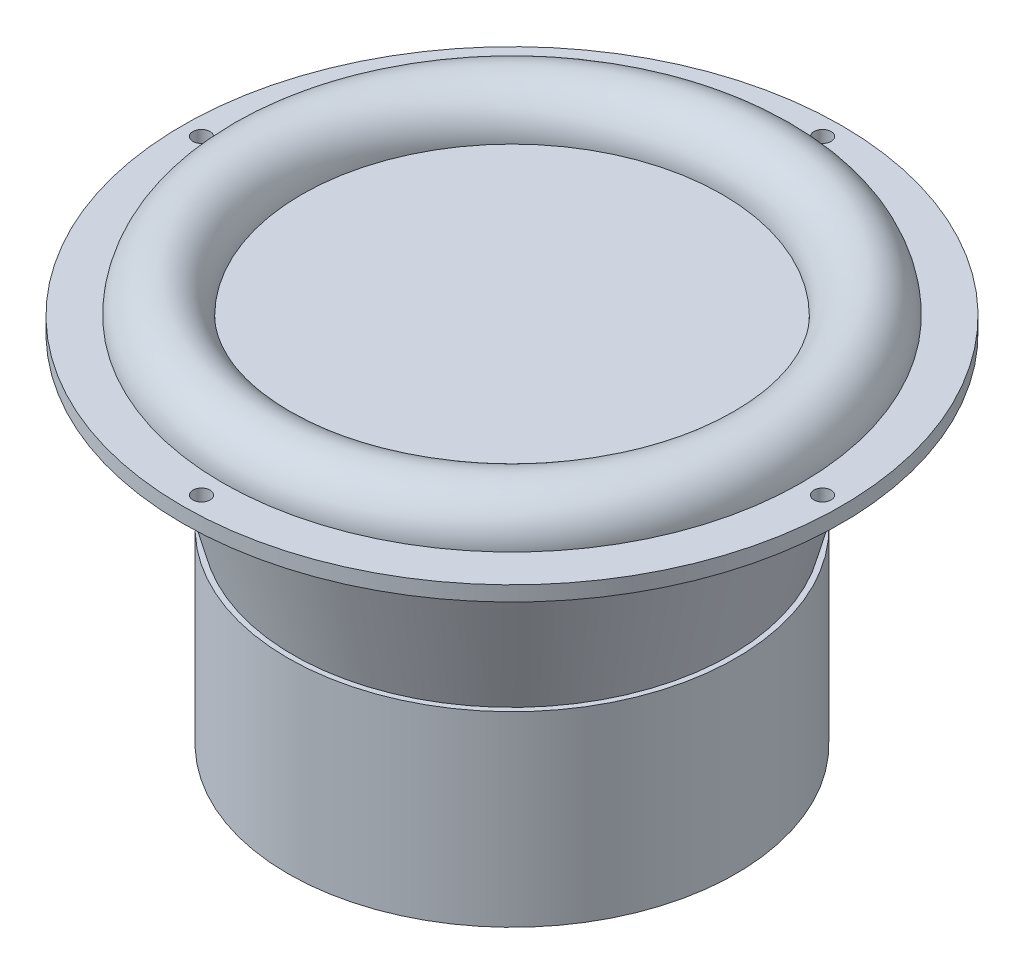
ISO-10303-21;
HEADER;
FILE_DESCRIPTION(('STEP AP214'),'2;1');
FILE_NAME('part.step','',(''),(''),'','','');
FILE_SCHEMA(('AUTOMOTIVE_DESIGN { 1 0 10303 214 1 1 1 1 }'));
ENDSEC;
DATA;
#1=APPLICATION_CONTEXT('core data for automotive mechanical design processes');
#2=APPLICATION_PROTOCOL_DEFINITION('international standard','automotive_design',2000,#1);
#3=PRODUCT_CONTEXT('',#1,'mechanical');
#4=PRODUCT('Part','Part','',(#3));
#5=PRODUCT_RELATED_PRODUCT_CATEGORY('part','',(#4));
#6=PRODUCT_DEFINITION_FORMATION('','',#4);
#7=PRODUCT_DEFINITION_CONTEXT('part definition',#1,'design');
#8=PRODUCT_DEFINITION('design','',#6,#7);
#9=PRODUCT_DEFINITION_SHAPE('','',#8);
#10=(LENGTH_UNIT() NAMED_UNIT(*) SI_UNIT(.MILLI.,.METRE.));
#11=(NAMED_UNIT(*) PLANE_ANGLE_UNIT() SI_UNIT($,.RADIAN.));
#12=(NAMED_UNIT(*) SI_UNIT($,.STERADIAN.) SOLID_ANGLE_UNIT());
#13=UNCERTAINTY_MEASURE_WITH_UNIT(LENGTH_MEASURE(1.E-05),#10,'distance_accuracy_value','');
#14=(GEOMETRIC_REPRESENTATION_CONTEXT(3) GLOBAL_UNCERTAINTY_ASSIGNED_CONTEXT((#13)) GLOBAL_UNIT_ASSIGNED_CONTEXT((#10,
#11,#12)) REPRESENTATION_CONTEXT('',''));
#15=CARTESIAN_POINT('',(0.,0.,0.));
#16=DIRECTION('',(0.,0.,1.));
#17=DIRECTION('',(1.,0.,0.));
#18=AXIS2_PLACEMENT_3D('',#15,#16,#17);
#19=CARTESIAN_POINT('',(60.,0.,0.));
#20=DIRECTION('',(0.,-1.,0.));
#21=DIRECTION('',(0.,0.,-1.));
#22=AXIS2_PLACEMENT_3D('',#19,#20,#21);
#23=PLANE('',#22);
#24=CARTESIAN_POINT('',(0.,0.,0.));
#25=DIRECTION('',(0.,-1.,0.));
#26=DIRECTION('',(0.,0.,-1.));
#27=AXIS2_PLACEMENT_3D('',#24,#25,#26);
#28=CIRCLE('',#27,60.);
#29=CARTESIAN_POINT('',(0.,0.,-60.));
#30=VERTEX_POINT('',#29);
#31=EDGE_CURVE('E10',#30,#30,#28,.T.);
#32=ORIENTED_EDGE('',*,*,#31,.T.);
#33=EDGE_LOOP('',(#32));
#34=FACE_BOUND('',#33,.T.);
#35=ADVANCED_FACE('F31',(#34),#23,.T.);
#36=CARTESIAN_POINT('',(0.,-46.3084579210508,0.));
#37=DIRECTION('',(0.,-1.,0.));
#38=DIRECTION('',(0.,0.,-1.));
#39=AXIS2_PLACEMENT_3D('',#36,#37,#38);
#40=CYLINDRICAL_SURFACE('',#39,60.);
#41=CARTESIAN_POINT('',(0.,50.,0.));
#42=DIRECTION('',(0.,-1.,0.));
#43=DIRECTION('',(0.,0.,-1.));
#44=AXIS2_PLACEMENT_3D('',#41,#42,#43);
#45=CIRCLE('',#44,60.);
#46=CARTESIAN_POINT('',(0.,50.,-60.));
#47=VERTEX_POINT('',#46);
#48=EDGE_CURVE('E38',#47,#47,#45,.T.);
#49=ORIENTED_EDGE('',*,*,#48,.T.);
#50=EDGE_LOOP('',(#49));
#51=FACE_BOUND('',#50,.T.);
#52=ORIENTED_EDGE('',*,*,#31,.F.);
#53=EDGE_LOOP('',(#52));
#54=FACE_BOUND('',#53,.T.);
#55=ADVANCED_FACE('F93',(#51,#54),#40,.T.);
#56=CARTESIAN_POINT('',(58.5851066636273,50.,0.));
#57=DIRECTION('',(0.,1.,0.));
#58=DIRECTION('',(0.,0.,1.));
#59=AXIS2_PLACEMENT_3D('',#56,#57,#58);
#60=PLANE('',#59);
#61=CARTESIAN_POINT('',(0.,50.,0.));
#62=DIRECTION('',(0.,-1.,0.));
#63=DIRECTION('',(0.,0.,-1.));
#64=AXIS2_PLACEMENT_3D('',#61,#62,#63);
#65=CIRCLE('',#64,58.5851066636273);
#66=CARTESIAN_POINT('',(0.,50.,-58.5851066636273));
#67=VERTEX_POINT('',#66);
#68=EDGE_CURVE('E43',#67,#67,#65,.T.);
#69=ORIENTED_EDGE('',*,*,#68,.T.);
#70=EDGE_LOOP('',(#69));
#71=FACE_BOUND('',#70,.T.);
#72=ORIENTED_EDGE('',*,*,#48,.F.);
#73=EDGE_LOOP('',(#72));
#74=FACE_BOUND('',#73,.T.);
#75=ADVANCED_FACE('F78',(#71,#74),#60,.T.);
#76=CARTESIAN_POINT('',(0.,50.,0.));
#77=DIRECTION('',(0.,1.,0.));
#78=DIRECTION('',(0.,0.,1.));
#79=AXIS2_PLACEMENT_3D('',#76,#77,#78);
#80=CONICAL_SURFACE('',#79,58.5851066636273,0.261799387799143);
#81=CARTESIAN_POINT('',(0.,95.4,0.));
#82=DIRECTION('',(0.,-1.,0.));
#83=DIRECTION('',(0.,0.,-1.));
#84=AXIS2_PLACEMENT_3D('',#81,#82,#83);
#85=CIRCLE('',#84,70.75);
#86=CARTESIAN_POINT('',(0.,95.4,-70.75));
#87=VERTEX_POINT('',#86);
#88=EDGE_CURVE('E73',#87,#87,#85,.T.);
#89=ORIENTED_EDGE('',*,*,#88,.T.);
#90=EDGE_LOOP('',(#89));
#91=FACE_BOUND('',#90,.T.);
#92=ORIENTED_EDGE('',*,*,#68,.F.);
#93=EDGE_LOOP('',(#92));
#94=FACE_BOUND('',#93,.T.);
#95=ADVANCED_FACE('F81',(#91,#94),#80,.T.);
#96=CARTESIAN_POINT('',(88.25,95.4,0.));
#97=DIRECTION('',(0.,-1.,0.));
#98=DIRECTION('',(0.,0.,-1.));
#99=AXIS2_PLACEMENT_3D('',#96,#97,#98);
#100=PLANE('',#99);
#101=CARTESIAN_POINT('',(-83.15,95.4,0.));
#102=DIRECTION('',(0.,-1.,0.));
#103=DIRECTION('',(0.,0.,-1.));
#104=AXIS2_PLACEMENT_3D('',#101,#102,#103);
#105=CIRCLE('',#104,2.29999999999998);
#106=CARTESIAN_POINT('',(-83.15,95.4,-2.29999999999998));
#107=VERTEX_POINT('',#106);
#108=EDGE_CURVE('E203',#107,#107,#105,.T.);
#109=ORIENTED_EDGE('',*,*,#108,.F.);
#110=EDGE_LOOP('',(#109));
#111=FACE_BOUND('',#110,.T.);
#112=CARTESIAN_POINT('',(0.,95.4,-83.15));
#113=DIRECTION('',(0.,-1.,0.));
#114=DIRECTION('',(0.,0.,-1.));
#115=AXIS2_PLACEMENT_3D('',#112,#113,#114);
#116=CIRCLE('',#115,2.29999999999998);
#117=CARTESIAN_POINT('',(0.,95.4,-85.45));
#118=VERTEX_POINT('',#117);
#119=EDGE_CURVE('E34',#118,#118,#116,.T.);
#120=ORIENTED_EDGE('',*,*,#119,.F.);
#121=EDGE_LOOP('',(#120));
#122=FACE_BOUND('',#121,.T.);
#123=CARTESIAN_POINT('',(83.15,95.4,0.));
#124=DIRECTION('',(0.,-1.,0.));
#125=DIRECTION('',(0.,0.,-1.));
#126=AXIS2_PLACEMENT_3D('',#123,#124,#125);
#127=CIRCLE('',#126,2.29999999999998);
#128=CARTESIAN_POINT('',(83.15,95.4,-2.29999999999998));
#129=VERTEX_POINT('',#128);
#130=EDGE_CURVE('E56',#129,#129,#127,.T.);
#131=ORIENTED_EDGE('',*,*,#130,.F.);
#132=EDGE_LOOP('',(#131));
#133=FACE_BOUND('',#132,.T.);
#134=CARTESIAN_POINT('',(0.,95.4,83.15));
#135=DIRECTION('',(0.,-1.,0.));
#136=DIRECTION('',(0.,0.,-1.));
#137=AXIS2_PLACEMENT_3D('',#134,#135,#136);
#138=CIRCLE('',#137,2.29999999999998);
#139=CARTESIAN_POINT('',(0.,95.4,80.85));
#140=VERTEX_POINT('',#139);
#141=EDGE_CURVE('E46',#140,#140,#138,.T.);
#142=ORIENTED_EDGE('',*,*,#141,.F.);
#143=EDGE_LOOP('',(#142));
#144=FACE_BOUND('',#143,.T.);
#145=CARTESIAN_POINT('',(0.,95.4,0.));
#146=DIRECTION('',(0.,-1.,0.));
#147=DIRECTION('',(0.,0.,-1.));
#148=AXIS2_PLACEMENT_3D('',#145,#146,#147);
#149=CIRCLE('',#148,88.25);
#150=CARTESIAN_POINT('',(0.,95.4,-88.25));
#151=VERTEX_POINT('',#150);
#152=EDGE_CURVE('E70',#151,#151,#149,.T.);
#153=ORIENTED_EDGE('',*,*,#152,.T.);
#154=EDGE_LOOP('',(#153));
#155=FACE_BOUND('',#154,.T.);
#156=ORIENTED_EDGE('',*,*,#88,.F.);
#157=EDGE_LOOP('',(#156));
#158=FACE_BOUND('',#157,.T.);
#159=ADVANCED_FACE('F83',(#111,#122,#133,#144,#155,#158),#100,.T.);
#160=CARTESIAN_POINT('',(0.,-46.3084579210508,0.));
#161=DIRECTION('',(0.,-1.,0.));
#162=DIRECTION('',(0.,0.,-1.));
#163=AXIS2_PLACEMENT_3D('',#160,#161,#162);
#164=CYLINDRICAL_SURFACE('',#163,88.25);
#165=CARTESIAN_POINT('',(0.,99.4,0.));
#166=DIRECTION('',(0.,-1.,0.));
#167=DIRECTION('',(0.,0.,-1.));
#168=AXIS2_PLACEMENT_3D('',#165,#166,#167);
#169=CIRCLE('',#168,88.25);
#170=CARTESIAN_POINT('',(0.,99.4,-88.25));
#171=VERTEX_POINT('',#170);
#172=EDGE_CURVE('E67',#171,#171,#169,.T.);
#173=ORIENTED_EDGE('',*,*,#172,.T.);
#174=EDGE_LOOP('',(#173));
#175=FACE_BOUND('',#174,.T.);
#176=ORIENTED_EDGE('',*,*,#152,.F.);
#177=EDGE_LOOP('',(#176));
#178=FACE_BOUND('',#177,.T.);
#179=ADVANCED_FACE('F90',(#175,#178),#164,.T.);
#180=CARTESIAN_POINT('',(77.5,99.4,0.));
#181=DIRECTION('',(0.,1.,0.));
#182=DIRECTION('',(0.,0.,1.));
#183=AXIS2_PLACEMENT_3D('',#180,#181,#182);
#184=PLANE('',#183);
#185=CARTESIAN_POINT('',(-83.15,99.4,0.));
#186=DIRECTION('',(0.,1.,0.));
#187=DIRECTION('',(0.,0.,1.));
#188=AXIS2_PLACEMENT_3D('',#185,#186,#187);
#189=CIRCLE('',#188,2.29999999999998);
#190=CARTESIAN_POINT('',(-83.15,99.4,2.29999999999998));
#191=VERTEX_POINT('',#190);
#192=EDGE_CURVE('E206',#191,#191,#189,.T.);
#193=ORIENTED_EDGE('',*,*,#192,.F.);
#194=EDGE_LOOP('',(#193));
#195=FACE_BOUND('',#194,.T.);
#196=CARTESIAN_POINT('',(0.,99.4,-83.15));
#197=DIRECTION('',(0.,1.,0.));
#198=DIRECTION('',(0.,0.,1.));
#199=AXIS2_PLACEMENT_3D('',#196,#197,#198);
#200=CIRCLE('',#199,2.29999999999999);
#201=CARTESIAN_POINT('',(0.,99.4,-80.85));
#202=VERTEX_POINT('',#201);
#203=EDGE_CURVE('E208',#202,#202,#200,.T.);
#204=ORIENTED_EDGE('',*,*,#203,.F.);
#205=EDGE_LOOP('',(#204));
#206=FACE_BOUND('',#205,.T.);
#207=CARTESIAN_POINT('',(83.15,99.4,0.));
#208=DIRECTION('',(0.,1.,0.));
#209=DIRECTION('',(0.,0.,1.));
#210=AXIS2_PLACEMENT_3D('',#207,#208,#209);
#211=CIRCLE('',#210,2.29999999999998);
#212=CARTESIAN_POINT('',(83.15,99.4,2.29999999999998));
#213=VERTEX_POINT('',#212);
#214=EDGE_CURVE('E61',#213,#213,#211,.T.);
#215=ORIENTED_EDGE('',*,*,#214,.F.);
#216=EDGE_LOOP('',(#215));
#217=FACE_BOUND('',#216,.T.);
#218=CARTESIAN_POINT('',(0.,99.4,83.15));
#219=DIRECTION('',(0.,1.,0.));
#220=DIRECTION('',(0.,0.,1.));
#221=AXIS2_PLACEMENT_3D('',#218,#219,#220);
#222=CIRCLE('',#221,2.29999999999999);
#223=CARTESIAN_POINT('',(0.,99.4,85.45));
#224=VERTEX_POINT('',#223);
#225=EDGE_CURVE('E49',#224,#224,#222,.T.);
#226=ORIENTED_EDGE('',*,*,#225,.F.);
#227=EDGE_LOOP('',(#226));
#228=FACE_BOUND('',#227,.T.);
#229=CARTESIAN_POINT('',(0.,99.4,0.));
#230=DIRECTION('',(0.,-1.,0.));
#231=DIRECTION('',(0.,0.,-1.));
#232=AXIS2_PLACEMENT_3D('',#229,#230,#231);
#233=CIRCLE('',#232,77.5);
#234=CARTESIAN_POINT('',(0.,99.4,-77.5));
#235=VERTEX_POINT('',#234);
#236=EDGE_CURVE('E53',#235,#235,#233,.T.);
#237=ORIENTED_EDGE('',*,*,#236,.T.);
#238=EDGE_LOOP('',(#237));
#239=FACE_BOUND('',#238,.T.);
#240=ORIENTED_EDGE('',*,*,#172,.F.);
#241=EDGE_LOOP('',(#240));
#242=FACE_BOUND('',#241,.T.);
#243=ADVANCED_FACE('F122',(#195,#206,#217,#228,#239,#242),#184,.T.);
#244=CARTESIAN_POINT('',(0.,99.4,0.));
#245=DIRECTION('',(0.,-1.,0.));
#246=DIRECTION('',(0.,0.,-1.));
#247=AXIS2_PLACEMENT_3D('',#244,#245,#246);
#248=TOROIDAL_SURFACE('',#247,66.9,10.6);
#249=CARTESIAN_POINT('',(0.,99.4,0.));
#250=DIRECTION('',(0.,-1.,0.));
#251=DIRECTION('',(0.,0.,-1.));
#252=AXIS2_PLACEMENT_3D('',#249,#250,#251);
#253=CIRCLE('',#252,56.3);
#254=CARTESIAN_POINT('',(0.,99.4,-56.3));
#255=VERTEX_POINT('',#254);
#256=EDGE_CURVE('E48',#255,#255,#253,.T.);
#257=ORIENTED_EDGE('',*,*,#256,.T.);
#258=EDGE_LOOP('',(#257));
#259=FACE_BOUND('',#258,.T.);
#260=ORIENTED_EDGE('',*,*,#236,.F.);
#261=EDGE_LOOP('',(#260));
#262=FACE_BOUND('',#261,.T.);
#263=ADVANCED_FACE('F130',(#259,#262),#248,.T.);
#264=CARTESIAN_POINT('',(0.,99.4,0.));
#265=DIRECTION('',(0.,1.,0.));
#266=DIRECTION('',(0.,0.,1.));
#267=AXIS2_PLACEMENT_3D('',#264,#265,#266);
#268=PLANE('',#267);
#269=ORIENTED_EDGE('',*,*,#256,.F.);
#270=EDGE_LOOP('',(#269));
#271=FACE_BOUND('',#270,.T.);
#272=ADVANCED_FACE('F135',(#271),#268,.T.);
#273=CARTESIAN_POINT('',(0.,99.4,83.15));
#274=DIRECTION('',(0.,1.,0.));
#275=DIRECTION('',(0.,0.,1.));
#276=AXIS2_PLACEMENT_3D('',#273,#274,#275);
#277=CYLINDRICAL_SURFACE('',#276,2.29999999999998);
#278=ORIENTED_EDGE('',*,*,#141,.T.);
#279=EDGE_LOOP('',(#278));
#280=FACE_BOUND('',#279,.T.);
#281=ORIENTED_EDGE('',*,*,#225,.T.);
#282=EDGE_LOOP('',(#281));
#283=FACE_BOUND('',#282,.T.);
#284=ADVANCED_FACE('F145',(#280,#283),#277,.F.);
#285=CARTESIAN_POINT('',(83.15,99.4,0.));
#286=DIRECTION('',(0.,1.,0.));
#287=DIRECTION('',(0.,0.,1.));
#288=AXIS2_PLACEMENT_3D('',#285,#286,#287);
#289=CYLINDRICAL_SURFACE('',#288,2.29999999999998);
#290=ORIENTED_EDGE('',*,*,#130,.T.);
#291=EDGE_LOOP('',(#290));
#292=FACE_BOUND('',#291,.T.);
#293=ORIENTED_EDGE('',*,*,#214,.T.);
#294=EDGE_LOOP('',(#293));
#295=FACE_BOUND('',#294,.T.);
#296=ADVANCED_FACE('F167',(#292,#295),#289,.F.);
#297=CARTESIAN_POINT('',(0.,99.4,-83.15));
#298=DIRECTION('',(0.,1.,0.));
#299=DIRECTION('',(0.,0.,1.));
#300=AXIS2_PLACEMENT_3D('',#297,#298,#299);
#301=CYLINDRICAL_SURFACE('',#300,2.29999999999998);
#302=ORIENTED_EDGE('',*,*,#119,.T.);
#303=EDGE_LOOP('',(#302));
#304=FACE_BOUND('',#303,.T.);
#305=ORIENTED_EDGE('',*,*,#203,.T.);
#306=EDGE_LOOP('',(#305));
#307=FACE_BOUND('',#306,.T.);
#308=ADVANCED_FACE('F176',(#304,#307),#301,.F.);
#309=CARTESIAN_POINT('',(-83.15,99.4,0.));
#310=DIRECTION('',(0.,1.,0.));
#311=DIRECTION('',(0.,0.,1.));
#312=AXIS2_PLACEMENT_3D('',#309,#310,#311);
#313=CYLINDRICAL_SURFACE('',#312,2.29999999999998);
#314=ORIENTED_EDGE('',*,*,#108,.T.);
#315=EDGE_LOOP('',(#314));
#316=FACE_BOUND('',#315,.T.);
#317=ORIENTED_EDGE('',*,*,#192,.T.);
#318=EDGE_LOOP('',(#317));
#319=FACE_BOUND('',#318,.T.);
#320=ADVANCED_FACE('F186',(#316,#319),#313,.F.);
#321=CLOSED_SHELL('',(#35,#55,#75,#95,#159,#179,#243,#263,#272,#284,#296,#308,#320));
#322=MANIFOLD_SOLID_BREP('B2',#321);
#323=ADVANCED_BREP_SHAPE_REPRESENTATION('',(#18,#322),#14);
#324=SHAPE_DEFINITION_REPRESENTATION(#9,#323);
ENDSEC;
END-ISO-10303-21;
